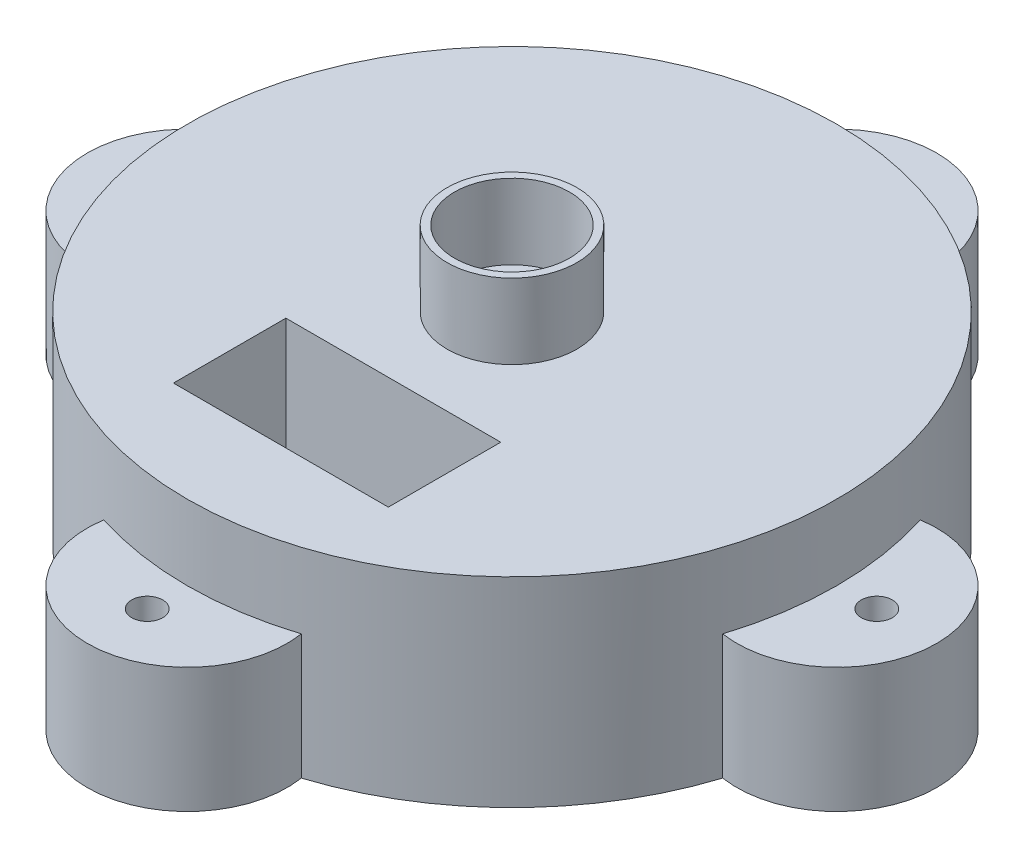
ISO-10303-21;
HEADER;
FILE_DESCRIPTION(('STEP AP214'),'2;1');
FILE_NAME('part.step','',(''),(''),'','','');
FILE_SCHEMA(('AUTOMOTIVE_DESIGN { 1 0 10303 214 1 1 1 1 }'));
ENDSEC;
DATA;
#1=APPLICATION_CONTEXT('core data for automotive mechanical design processes');
#2=APPLICATION_PROTOCOL_DEFINITION('international standard','automotive_design',2000,#1);
#3=PRODUCT_CONTEXT('',#1,'mechanical');
#4=PRODUCT('Part','Part','',(#3));
#5=PRODUCT_RELATED_PRODUCT_CATEGORY('part','',(#4));
#6=PRODUCT_DEFINITION_FORMATION('','',#4);
#7=PRODUCT_DEFINITION_CONTEXT('part definition',#1,'design');
#8=PRODUCT_DEFINITION('design','',#6,#7);
#9=PRODUCT_DEFINITION_SHAPE('','',#8);
#10=(LENGTH_UNIT() NAMED_UNIT(*) SI_UNIT(.MILLI.,.METRE.));
#11=(NAMED_UNIT(*) PLANE_ANGLE_UNIT() SI_UNIT($,.RADIAN.));
#12=(NAMED_UNIT(*) SI_UNIT($,.STERADIAN.) SOLID_ANGLE_UNIT());
#13=UNCERTAINTY_MEASURE_WITH_UNIT(LENGTH_MEASURE(1.E-05),#10,'distance_accuracy_value','');
#14=(GEOMETRIC_REPRESENTATION_CONTEXT(3) GLOBAL_UNCERTAINTY_ASSIGNED_CONTEXT((#13)) GLOBAL_UNIT_ASSIGNED_CONTEXT((#10,
#11,#12)) REPRESENTATION_CONTEXT('',''));
#15=CARTESIAN_POINT('',(0.,0.,0.));
#16=DIRECTION('',(0.,0.,1.));
#17=DIRECTION('',(1.,0.,0.));
#18=AXIS2_PLACEMENT_3D('',#15,#16,#17);
#19=CARTESIAN_POINT('',(0.,40.,0.));
#20=DIRECTION('',(0.,-1.,0.));
#21=DIRECTION('',(0.,0.,-1.));
#22=AXIS2_PLACEMENT_3D('',#19,#20,#21);
#23=CYLINDRICAL_SURFACE('',#22,65.);
#24=DIRECTION('',(0.,-1.,0.));
#25=VECTOR('',#24,1.);
#26=CARTESIAN_POINT('',(61.9230515913332,25.,19.7619756506552));
#27=LINE('',#26,#25);
#28=CARTESIAN_POINT('',(61.9230515913332,25.,19.7619756506552));
#29=VERTEX_POINT('',#28);
#30=CARTESIAN_POINT('',(61.9230515913332,0.,19.7619756506552));
#31=VERTEX_POINT('',#30);
#32=EDGE_CURVE('E206',#29,#31,#27,.T.);
#33=ORIENTED_EDGE('',*,*,#32,.F.);
#34=CARTESIAN_POINT('',(0.,25.,0.));
#35=DIRECTION('',(0.,-1.,0.));
#36=DIRECTION('',(0.,0.,-1.));
#37=AXIS2_PLACEMENT_3D('',#34,#35,#36);
#38=CIRCLE('',#37,65.);
#39=CARTESIAN_POINT('',(61.9231022547189,25.,-19.7618168990512));
#40=VERTEX_POINT('',#39);
#41=EDGE_CURVE('E199',#40,#29,#38,.T.);
#42=ORIENTED_EDGE('',*,*,#41,.F.);
#43=DIRECTION('',(0.,-1.,0.));
#44=VECTOR('',#43,1.);
#45=CARTESIAN_POINT('',(61.9231022547189,25.,-19.7618168990512));
#46=LINE('',#45,#44);
#47=CARTESIAN_POINT('',(61.9231022547189,0.,-19.7618168990512));
#48=VERTEX_POINT('',#47);
#49=EDGE_CURVE('E211',#40,#48,#46,.T.);
#50=ORIENTED_EDGE('',*,*,#49,.T.);
#51=CARTESIAN_POINT('',(0.,0.,0.));
#52=DIRECTION('',(0.,1.,0.));
#53=DIRECTION('',(0.,0.,1.));
#54=AXIS2_PLACEMENT_3D('',#51,#52,#53);
#55=CIRCLE('',#54,65.);
#56=CARTESIAN_POINT('',(19.761975650655,0.,-61.9230515913333));
#57=VERTEX_POINT('',#56);
#58=EDGE_CURVE('E313',#48,#57,#55,.T.);
#59=ORIENTED_EDGE('',*,*,#58,.T.);
#60=DIRECTION('',(0.,-1.,0.));
#61=VECTOR('',#60,1.);
#62=CARTESIAN_POINT('',(19.761975650655,25.,-61.9230515913333));
#63=LINE('',#62,#61);
#64=CARTESIAN_POINT('',(19.761975650655,25.,-61.9230515913333));
#65=VERTEX_POINT('',#64);
#66=EDGE_CURVE('E227',#65,#57,#63,.T.);
#67=ORIENTED_EDGE('',*,*,#66,.F.);
#68=CARTESIAN_POINT('',(0.,25.,0.));
#69=DIRECTION('',(0.,-1.,0.));
#70=DIRECTION('',(0.,0.,-1.));
#71=AXIS2_PLACEMENT_3D('',#68,#69,#70);
#72=CIRCLE('',#71,65.);
#73=CARTESIAN_POINT('',(-19.7618168990514,25.,-61.9231022547188));
#74=VERTEX_POINT('',#73);
#75=EDGE_CURVE('E220',#74,#65,#72,.T.);
#76=ORIENTED_EDGE('',*,*,#75,.F.);
#77=DIRECTION('',(0.,-1.,0.));
#78=VECTOR('',#77,1.);
#79=CARTESIAN_POINT('',(-19.7618168990514,25.,-61.9231022547188));
#80=LINE('',#79,#78);
#81=CARTESIAN_POINT('',(-19.7618168990514,0.,-61.9231022547188));
#82=VERTEX_POINT('',#81);
#83=EDGE_CURVE('E232',#74,#82,#80,.T.);
#84=ORIENTED_EDGE('',*,*,#83,.T.);
#85=CARTESIAN_POINT('',(-61.9230515913333,0.,-19.7619756506548));
#86=VERTEX_POINT('',#85);
#87=EDGE_CURVE('E315',#82,#86,#55,.T.);
#88=ORIENTED_EDGE('',*,*,#87,.T.);
#89=DIRECTION('',(0.,-1.,0.));
#90=VECTOR('',#89,1.);
#91=CARTESIAN_POINT('',(-61.9230515913333,25.,-19.7619756506548));
#92=LINE('',#91,#90);
#93=CARTESIAN_POINT('',(-61.9230515913333,25.,-19.7619756506548));
#94=VERTEX_POINT('',#93);
#95=EDGE_CURVE('E248',#94,#86,#92,.T.);
#96=ORIENTED_EDGE('',*,*,#95,.F.);
#97=CARTESIAN_POINT('',(0.,25.,0.));
#98=DIRECTION('',(0.,-1.,0.));
#99=DIRECTION('',(0.,0.,-1.));
#100=AXIS2_PLACEMENT_3D('',#97,#98,#99);
#101=CIRCLE('',#100,65.);
#102=CARTESIAN_POINT('',(-61.9231022547188,25.,19.7618168990516));
#103=VERTEX_POINT('',#102);
#104=EDGE_CURVE('E241',#103,#94,#101,.T.);
#105=ORIENTED_EDGE('',*,*,#104,.F.);
#106=DIRECTION('',(0.,-1.,0.));
#107=VECTOR('',#106,1.);
#108=CARTESIAN_POINT('',(-61.9231022547188,25.,19.7618168990516));
#109=LINE('',#108,#107);
#110=CARTESIAN_POINT('',(-61.9231022547188,0.,19.7618168990516));
#111=VERTEX_POINT('',#110);
#112=EDGE_CURVE('E253',#103,#111,#109,.T.);
#113=ORIENTED_EDGE('',*,*,#112,.T.);
#114=CARTESIAN_POINT('',(-19.7619756506545,0.,61.9230515913334));
#115=VERTEX_POINT('',#114);
#116=EDGE_CURVE('E310',#111,#115,#55,.T.);
#117=ORIENTED_EDGE('',*,*,#116,.T.);
#118=DIRECTION('',(0.,-1.,0.));
#119=VECTOR('',#118,1.);
#120=CARTESIAN_POINT('',(-19.7619756506545,25.,61.9230515913334));
#121=LINE('',#120,#119);
#122=CARTESIAN_POINT('',(-19.7619756506545,25.,61.9230515913334));
#123=VERTEX_POINT('',#122);
#124=EDGE_CURVE('E269',#123,#115,#121,.T.);
#125=ORIENTED_EDGE('',*,*,#124,.F.);
#126=CARTESIAN_POINT('',(0.,25.,0.));
#127=DIRECTION('',(0.,-1.,0.));
#128=DIRECTION('',(0.,0.,-1.));
#129=AXIS2_PLACEMENT_3D('',#126,#127,#128);
#130=CIRCLE('',#129,65.);
#131=CARTESIAN_POINT('',(19.7618168990518,25.,61.9231022547187));
#132=VERTEX_POINT('',#131);
#133=EDGE_CURVE('E266',#132,#123,#130,.T.);
#134=ORIENTED_EDGE('',*,*,#133,.F.);
#135=DIRECTION('',(0.,-1.,0.));
#136=VECTOR('',#135,1.);
#137=CARTESIAN_POINT('',(19.7618168990518,25.,61.9231022547187));
#138=LINE('',#137,#136);
#139=CARTESIAN_POINT('',(19.7618168990518,0.,61.9231022547187));
#140=VERTEX_POINT('',#139);
#141=EDGE_CURVE('E274',#132,#140,#138,.T.);
#142=ORIENTED_EDGE('',*,*,#141,.T.);
#143=EDGE_CURVE('E312',#140,#31,#55,.T.);
#144=ORIENTED_EDGE('',*,*,#143,.T.);
#145=EDGE_LOOP('',(#33,#42,#50,#59,#67,#76,#84,#88,#96,#105,#113,#117,#125,#134,#142,#144));
#146=FACE_BOUND('',#145,.T.);
#147=CARTESIAN_POINT('',(0.,40.,0.));
#148=DIRECTION('',(0.,1.,0.));
#149=DIRECTION('',(0.,0.,1.));
#150=AXIS2_PLACEMENT_3D('',#147,#148,#149);
#151=CIRCLE('',#150,65.);
#152=CARTESIAN_POINT('',(0.,40.,65.));
#153=VERTEX_POINT('',#152);
#154=EDGE_CURVE('E46',#153,#153,#151,.T.);
#155=ORIENTED_EDGE('',*,*,#154,.F.);
#156=EDGE_LOOP('',(#155));
#157=FACE_BOUND('',#156,.T.);
#158=DIRECTION('',(0.,-1.,0.));
#159=VECTOR('',#158,1.);
#160=CARTESIAN_POINT('',(-58.4024663648858,40.,28.5333475515648));
#161=LINE('',#160,#159);
#162=CARTESIAN_POINT('',(-58.4024663648858,12.326049230071,28.5333475515648));
#163=VERTEX_POINT('',#162);
#164=CARTESIAN_POINT('',(-58.4024663648858,7.32604923007102,28.5333475515648));
#165=VERTEX_POINT('',#164);
#166=EDGE_CURVE('E154',#163,#165,#161,.T.);
#167=ORIENTED_EDGE('',*,*,#166,.F.);
#168=CARTESIAN_POINT('',(0.,12.326049230071,0.));
#169=DIRECTION('',(0.,-1.,0.));
#170=DIRECTION('',(0.,0.,-1.));
#171=AXIS2_PLACEMENT_3D('',#168,#169,#170);
#172=CIRCLE('',#171,65.);
#173=CARTESIAN_POINT('',(-48.2684954287439,12.326049230071,43.5333475515648));
#174=VERTEX_POINT('',#173);
#175=EDGE_CURVE('E157',#174,#163,#172,.T.);
#176=ORIENTED_EDGE('',*,*,#175,.F.);
#177=DIRECTION('',(0.,-1.,0.));
#178=VECTOR('',#177,1.);
#179=CARTESIAN_POINT('',(-48.2684954287439,40.,43.5333475515648));
#180=LINE('',#179,#178);
#181=CARTESIAN_POINT('',(-48.2684954287439,7.32604923007102,43.5333475515648));
#182=VERTEX_POINT('',#181);
#183=EDGE_CURVE('E181',#182,#174,#180,.F.);
#184=ORIENTED_EDGE('',*,*,#183,.F.);
#185=CARTESIAN_POINT('',(0.,7.32604923007102,0.));
#186=DIRECTION('',(0.,1.,0.));
#187=DIRECTION('',(0.,0.,1.));
#188=AXIS2_PLACEMENT_3D('',#185,#186,#187);
#189=CIRCLE('',#188,65.);
#190=EDGE_CURVE('E183',#165,#182,#189,.T.);
#191=ORIENTED_EDGE('',*,*,#190,.F.);
#192=EDGE_LOOP('',(#167,#176,#184,#191));
#193=FACE_BOUND('',#192,.T.);
#194=ADVANCED_FACE('F39',(#146,#157,#193),#23,.T.);
#195=CARTESIAN_POINT('',(-21.5,2.,23.75));
#196=DIRECTION('',(1.,0.,0.));
#197=DIRECTION('',(0.,0.,-1.));
#198=AXIS2_PLACEMENT_3D('',#195,#196,#197);
#199=PLANE('',#198);
#200=DIRECTION('',(0.,0.,-1.));
#201=VECTOR('',#200,1.);
#202=CARTESIAN_POINT('',(-21.5,40.,23.75));
#203=LINE('',#202,#201);
#204=CARTESIAN_POINT('',(-21.5,40.,46.25));
#205=VERTEX_POINT('',#204);
#206=CARTESIAN_POINT('',(-21.5,40.,23.75));
#207=VERTEX_POINT('',#206);
#208=EDGE_CURVE('E277',#205,#207,#203,.T.);
#209=ORIENTED_EDGE('',*,*,#208,.F.);
#210=DIRECTION('',(0.,1.,0.));
#211=VECTOR('',#210,1.);
#212=CARTESIAN_POINT('',(-21.5,2.,46.25));
#213=LINE('',#212,#211);
#214=CARTESIAN_POINT('',(-21.5,2.,46.25));
#215=VERTEX_POINT('',#214);
#216=EDGE_CURVE('E290',#215,#205,#213,.T.);
#217=ORIENTED_EDGE('',*,*,#216,.F.);
#218=DIRECTION('',(0.,0.,-1.));
#219=VECTOR('',#218,1.);
#220=CARTESIAN_POINT('',(-21.5,2.,23.75));
#221=LINE('',#220,#219);
#222=CARTESIAN_POINT('',(-21.5,2.,23.75));
#223=VERTEX_POINT('',#222);
#224=EDGE_CURVE('E280',#215,#223,#221,.T.);
#225=ORIENTED_EDGE('',*,*,#224,.T.);
#226=DIRECTION('',(0.,1.,0.));
#227=VECTOR('',#226,1.);
#228=CARTESIAN_POINT('',(-21.5,2.,23.75));
#229=LINE('',#228,#227);
#230=EDGE_CURVE('E307',#223,#207,#229,.T.);
#231=ORIENTED_EDGE('',*,*,#230,.T.);
#232=EDGE_LOOP('',(#209,#217,#225,#231));
#233=FACE_BOUND('',#232,.T.);
#234=DIRECTION('',(0.,0.,-1.));
#235=VECTOR('',#234,1.);
#236=CARTESIAN_POINT('',(-21.5,12.326049230071,43.5333475515648));
#237=LINE('',#236,#235);
#238=CARTESIAN_POINT('',(-21.5,12.326049230071,43.5333475515648));
#239=VERTEX_POINT('',#238);
#240=CARTESIAN_POINT('',(-21.5,12.326049230071,28.5333475515648));
#241=VERTEX_POINT('',#240);
#242=EDGE_CURVE('E171',#239,#241,#237,.T.);
#243=ORIENTED_EDGE('',*,*,#242,.T.);
#244=DIRECTION('',(0.,-1.,0.));
#245=VECTOR('',#244,1.);
#246=CARTESIAN_POINT('',(-21.5,7.32604923007102,28.5333475515648));
#247=LINE('',#246,#245);
#248=CARTESIAN_POINT('',(-21.5,7.32604923007102,28.5333475515648));
#249=VERTEX_POINT('',#248);
#250=EDGE_CURVE('E61',#241,#249,#247,.T.);
#251=ORIENTED_EDGE('',*,*,#250,.T.);
#252=DIRECTION('',(0.,0.,1.));
#253=VECTOR('',#252,1.);
#254=CARTESIAN_POINT('',(-21.5,7.32604923007102,43.5333475515648));
#255=LINE('',#254,#253);
#256=CARTESIAN_POINT('',(-21.5,7.32604923007102,43.5333475515648));
#257=VERTEX_POINT('',#256);
#258=EDGE_CURVE('E161',#249,#257,#255,.T.);
#259=ORIENTED_EDGE('',*,*,#258,.T.);
#260=DIRECTION('',(0.,1.,0.));
#261=VECTOR('',#260,1.);
#262=CARTESIAN_POINT('',(-21.5,7.32604923007102,43.5333475515648));
#263=LINE('',#262,#261);
#264=EDGE_CURVE('E167',#257,#239,#263,.T.);
#265=ORIENTED_EDGE('',*,*,#264,.T.);
#266=EDGE_LOOP('',(#243,#251,#259,#265));
#267=FACE_BOUND('',#266,.T.);
#268=ADVANCED_FACE('F170',(#233,#267),#199,.T.);
#269=CARTESIAN_POINT('',(0.,40.,0.));
#270=DIRECTION('',(0.,1.,0.));
#271=DIRECTION('',(0.,0.,1.));
#272=AXIS2_PLACEMENT_3D('',#269,#270,#271);
#273=PLANE('',#272);
#274=CARTESIAN_POINT('',(0.,40.,0.));
#275=DIRECTION('',(0.,1.,0.));
#276=DIRECTION('',(0.,0.,1.));
#277=AXIS2_PLACEMENT_3D('',#274,#275,#276);
#278=CIRCLE('',#277,13.);
#279=CARTESIAN_POINT('',(0.,40.,13.));
#280=VERTEX_POINT('',#279);
#281=EDGE_CURVE('E11',#280,#280,#278,.T.);
#282=ORIENTED_EDGE('',*,*,#281,.F.);
#283=EDGE_LOOP('',(#282));
#284=FACE_BOUND('',#283,.T.);
#285=ORIENTED_EDGE('',*,*,#154,.T.);
#286=EDGE_LOOP('',(#285));
#287=FACE_BOUND('',#286,.T.);
#288=DIRECTION('',(-1.,0.,0.));
#289=VECTOR('',#288,1.);
#290=CARTESIAN_POINT('',(21.5,40.,46.25));
#291=LINE('',#290,#289);
#292=CARTESIAN_POINT('',(21.5,40.,46.25));
#293=VERTEX_POINT('',#292);
#294=EDGE_CURVE('E284',#293,#205,#291,.T.);
#295=ORIENTED_EDGE('',*,*,#294,.T.);
#296=ORIENTED_EDGE('',*,*,#208,.T.);
#297=DIRECTION('',(1.,0.,0.));
#298=VECTOR('',#297,1.);
#299=CARTESIAN_POINT('',(21.5,40.,23.75));
#300=LINE('',#299,#298);
#301=CARTESIAN_POINT('',(21.5,40.,23.75));
#302=VERTEX_POINT('',#301);
#303=EDGE_CURVE('E293',#207,#302,#300,.T.);
#304=ORIENTED_EDGE('',*,*,#303,.T.);
#305=DIRECTION('',(0.,0.,1.));
#306=VECTOR('',#305,1.);
#307=CARTESIAN_POINT('',(21.5,40.,23.75));
#308=LINE('',#307,#306);
#309=EDGE_CURVE('E296',#302,#293,#308,.T.);
#310=ORIENTED_EDGE('',*,*,#309,.T.);
#311=EDGE_LOOP('',(#295,#296,#304,#310));
#312=FACE_BOUND('',#311,.T.);
#313=ADVANCED_FACE('F345',(#284,#287,#312),#273,.T.);
#314=CARTESIAN_POINT('',(0.,0.,0.));
#315=DIRECTION('',(0.,1.,0.));
#316=DIRECTION('',(0.,0.,1.));
#317=AXIS2_PLACEMENT_3D('',#314,#315,#316);
#318=PLANE('',#317);
#319=ORIENTED_EDGE('',*,*,#143,.F.);
#320=CARTESIAN_POINT('',(-8.33199405442242E-05,0.,64.9999999999466));
#321=DIRECTION('',(0.,-1.,0.));
#322=DIRECTION('',(0.,0.,-1.));
#323=AXIS2_PLACEMENT_3D('',#320,#321,#322);
#324=CIRCLE('',#323,20.);
#325=EDGE_CURVE('E263',#115,#140,#324,.F.);
#326=ORIENTED_EDGE('',*,*,#325,.F.);
#327=ORIENTED_EDGE('',*,*,#116,.F.);
#328=CARTESIAN_POINT('',(-64.9999999999466,0.,-8.33199407711705E-05));
#329=DIRECTION('',(0.,-1.,0.));
#330=DIRECTION('',(0.,0.,-1.));
#331=AXIS2_PLACEMENT_3D('',#328,#329,#330);
#332=CIRCLE('',#331,20.);
#333=EDGE_CURVE('E235',#86,#111,#332,.F.);
#334=ORIENTED_EDGE('',*,*,#333,.F.);
#335=ORIENTED_EDGE('',*,*,#87,.F.);
#336=CARTESIAN_POINT('',(8.33199409981168E-05,0.,-64.9999999999466));
#337=DIRECTION('',(0.,-1.,0.));
#338=DIRECTION('',(0.,0.,-1.));
#339=AXIS2_PLACEMENT_3D('',#336,#337,#338);
#340=CIRCLE('',#339,20.);
#341=EDGE_CURVE('E214',#57,#82,#340,.F.);
#342=ORIENTED_EDGE('',*,*,#341,.F.);
#343=ORIENTED_EDGE('',*,*,#58,.F.);
#344=CARTESIAN_POINT('',(64.9999999999466,0.,8.33199412250631E-05));
#345=DIRECTION('',(0.,-1.,0.));
#346=DIRECTION('',(0.,0.,-1.));
#347=AXIS2_PLACEMENT_3D('',#344,#345,#346);
#348=CIRCLE('',#347,20.);
#349=EDGE_CURVE('E195',#31,#48,#348,.F.);
#350=ORIENTED_EDGE('',*,*,#349,.F.);
#351=EDGE_LOOP('',(#319,#326,#327,#334,#335,#342,#343,#350));
#352=FACE_BOUND('',#351,.T.);
#353=CARTESIAN_POINT('',(-8.33199405432445E-05,0.,72.9999999999466));
#354=DIRECTION('',(0.,-1.,0.));
#355=DIRECTION('',(0.,0.,-1.));
#356=AXIS2_PLACEMENT_3D('',#353,#354,#355);
#357=CIRCLE('',#356,3.1);
#358=CARTESIAN_POINT('',(-8.33199405432445E-05,0.,69.8999999999466));
#359=VERTEX_POINT('',#358);
#360=EDGE_CURVE('E256',#359,#359,#357,.F.);
#361=ORIENTED_EDGE('',*,*,#360,.T.);
#362=EDGE_LOOP('',(#361));
#363=FACE_BOUND('',#362,.T.);
#364=CARTESIAN_POINT('',(-72.9999999999466,0.,-8.33199407981226E-05));
#365=DIRECTION('',(0.,-1.,0.));
#366=DIRECTION('',(0.,0.,-1.));
#367=AXIS2_PLACEMENT_3D('',#364,#365,#366);
#368=CIRCLE('',#367,3.1);
#369=CARTESIAN_POINT('',(-72.9999999999466,0.,-3.1000833199408));
#370=VERTEX_POINT('',#369);
#371=EDGE_CURVE('E242',#370,#370,#368,.F.);
#372=ORIENTED_EDGE('',*,*,#371,.T.);
#373=EDGE_LOOP('',(#372));
#374=FACE_BOUND('',#373,.T.);
#375=CARTESIAN_POINT('',(8.33199410530008E-05,0.,-72.9999999999466));
#376=DIRECTION('',(0.,-1.,0.));
#377=DIRECTION('',(0.,0.,-1.));
#378=AXIS2_PLACEMENT_3D('',#375,#376,#377);
#379=CIRCLE('',#378,3.1);
#380=CARTESIAN_POINT('',(8.33199410530008E-05,0.,-76.0999999999466));
#381=VERTEX_POINT('',#380);
#382=EDGE_CURVE('E221',#381,#381,#379,.F.);
#383=ORIENTED_EDGE('',*,*,#382,.T.);
#384=EDGE_LOOP('',(#383));
#385=FACE_BOUND('',#384,.T.);
#386=CARTESIAN_POINT('',(72.9999999999466,0.,8.33199413078789E-05));
#387=DIRECTION('',(0.,-1.,0.));
#388=DIRECTION('',(0.,0.,-1.));
#389=AXIS2_PLACEMENT_3D('',#386,#387,#388);
#390=CIRCLE('',#389,3.1);
#391=CARTESIAN_POINT('',(72.9999999999466,0.,-3.09991668005869));
#392=VERTEX_POINT('',#391);
#393=EDGE_CURVE('E200',#392,#392,#390,.F.);
#394=ORIENTED_EDGE('',*,*,#393,.T.);
#395=EDGE_LOOP('',(#394));
#396=FACE_BOUND('',#395,.T.);
#397=ADVANCED_FACE('F325',(#352,#363,#374,#385,#396),#318,.F.);
#398=CARTESIAN_POINT('',(21.5,2.,23.75));
#399=DIRECTION('',(0.,0.,1.));
#400=DIRECTION('',(1.,0.,0.));
#401=AXIS2_PLACEMENT_3D('',#398,#399,#400);
#402=PLANE('',#401);
#403=ORIENTED_EDGE('',*,*,#303,.F.);
#404=ORIENTED_EDGE('',*,*,#230,.F.);
#405=DIRECTION('',(1.,0.,0.));
#406=VECTOR('',#405,1.);
#407=CARTESIAN_POINT('',(21.5,2.,23.75));
#408=LINE('',#407,#406);
#409=CARTESIAN_POINT('',(21.5,2.,23.75));
#410=VERTEX_POINT('',#409);
#411=EDGE_CURVE('E283',#223,#410,#408,.T.);
#412=ORIENTED_EDGE('',*,*,#411,.T.);
#413=DIRECTION('',(0.,1.,0.));
#414=VECTOR('',#413,1.);
#415=CARTESIAN_POINT('',(21.5,2.,23.75));
#416=LINE('',#415,#414);
#417=EDGE_CURVE('E305',#410,#302,#416,.T.);
#418=ORIENTED_EDGE('',*,*,#417,.T.);
#419=EDGE_LOOP('',(#403,#404,#412,#418));
#420=FACE_BOUND('',#419,.T.);
#421=ADVANCED_FACE('F344',(#420),#402,.T.);
#422=CARTESIAN_POINT('',(21.5,2.,23.75));
#423=DIRECTION('',(-1.,0.,0.));
#424=DIRECTION('',(0.,0.,1.));
#425=AXIS2_PLACEMENT_3D('',#422,#423,#424);
#426=PLANE('',#425);
#427=ORIENTED_EDGE('',*,*,#309,.F.);
#428=ORIENTED_EDGE('',*,*,#417,.F.);
#429=DIRECTION('',(0.,0.,1.));
#430=VECTOR('',#429,1.);
#431=CARTESIAN_POINT('',(21.5,2.,23.75));
#432=LINE('',#431,#430);
#433=CARTESIAN_POINT('',(21.5,2.,46.25));
#434=VERTEX_POINT('',#433);
#435=EDGE_CURVE('E286',#410,#434,#432,.T.);
#436=ORIENTED_EDGE('',*,*,#435,.T.);
#437=DIRECTION('',(0.,1.,0.));
#438=VECTOR('',#437,1.);
#439=CARTESIAN_POINT('',(21.5,2.,46.25));
#440=LINE('',#439,#438);
#441=EDGE_CURVE('E303',#434,#293,#440,.T.);
#442=ORIENTED_EDGE('',*,*,#441,.T.);
#443=EDGE_LOOP('',(#427,#428,#436,#442));
#444=FACE_BOUND('',#443,.T.);
#445=ADVANCED_FACE('F383',(#444),#426,.T.);
#446=CARTESIAN_POINT('',(21.5,2.,46.25));
#447=DIRECTION('',(0.,0.,-1.));
#448=DIRECTION('',(0.,1.,0.));
#449=AXIS2_PLACEMENT_3D('',#446,#447,#448);
#450=PLANE('',#449);
#451=ORIENTED_EDGE('',*,*,#294,.F.);
#452=ORIENTED_EDGE('',*,*,#441,.F.);
#453=DIRECTION('',(-1.,0.,0.));
#454=VECTOR('',#453,1.);
#455=CARTESIAN_POINT('',(21.5,2.,46.25));
#456=LINE('',#455,#454);
#457=EDGE_CURVE('E288',#434,#215,#456,.T.);
#458=ORIENTED_EDGE('',*,*,#457,.T.);
#459=ORIENTED_EDGE('',*,*,#216,.T.);
#460=EDGE_LOOP('',(#451,#452,#458,#459));
#461=FACE_BOUND('',#460,.T.);
#462=ADVANCED_FACE('F387',(#461),#450,.T.);
#463=CARTESIAN_POINT('',(0.,2.,0.));
#464=DIRECTION('',(0.,-1.,0.));
#465=DIRECTION('',(0.,0.,-1.));
#466=AXIS2_PLACEMENT_3D('',#463,#464,#465);
#467=PLANE('',#466);
#468=ORIENTED_EDGE('',*,*,#224,.F.);
#469=ORIENTED_EDGE('',*,*,#457,.F.);
#470=ORIENTED_EDGE('',*,*,#435,.F.);
#471=ORIENTED_EDGE('',*,*,#411,.F.);
#472=EDGE_LOOP('',(#468,#469,#470,#471));
#473=FACE_BOUND('',#472,.T.);
#474=ADVANCED_FACE('F391',(#473),#467,.F.);
#475=CARTESIAN_POINT('',(-8.33199405442242E-05,25.,64.9999999999466));
#476=DIRECTION('',(0.,-1.,0.));
#477=DIRECTION('',(0.,0.,-1.));
#478=AXIS2_PLACEMENT_3D('',#475,#476,#477);
#479=CYLINDRICAL_SURFACE('',#478,20.);
#480=ORIENTED_EDGE('',*,*,#325,.T.);
#481=ORIENTED_EDGE('',*,*,#141,.F.);
#482=CARTESIAN_POINT('',(-8.33199405442242E-05,25.,64.9999999999466));
#483=DIRECTION('',(0.,-1.,0.));
#484=DIRECTION('',(0.,0.,-1.));
#485=AXIS2_PLACEMENT_3D('',#482,#483,#484);
#486=CIRCLE('',#485,20.);
#487=EDGE_CURVE('E262',#123,#132,#486,.F.);
#488=ORIENTED_EDGE('',*,*,#487,.F.);
#489=ORIENTED_EDGE('',*,*,#124,.T.);
#490=EDGE_LOOP('',(#480,#481,#488,#489));
#491=FACE_BOUND('',#490,.T.);
#492=ADVANCED_FACE('F395',(#491),#479,.T.);
#493=CARTESIAN_POINT('',(-8.33199405432445E-05,25.,72.9999999999466));
#494=DIRECTION('',(0.,-1.,0.));
#495=DIRECTION('',(0.,0.,-1.));
#496=AXIS2_PLACEMENT_3D('',#493,#494,#495);
#497=CYLINDRICAL_SURFACE('',#496,3.1);
#498=CARTESIAN_POINT('',(-8.33199405432445E-05,25.,72.9999999999466));
#499=DIRECTION('',(0.,-1.,0.));
#500=DIRECTION('',(0.,0.,-1.));
#501=AXIS2_PLACEMENT_3D('',#498,#499,#500);
#502=CIRCLE('',#501,3.1);
#503=CARTESIAN_POINT('',(-8.33199405432445E-05,25.,69.8999999999466));
#504=VERTEX_POINT('',#503);
#505=EDGE_CURVE('E259',#504,#504,#502,.F.);
#506=ORIENTED_EDGE('',*,*,#505,.T.);
#507=EDGE_LOOP('',(#506));
#508=FACE_BOUND('',#507,.T.);
#509=ORIENTED_EDGE('',*,*,#360,.F.);
#510=EDGE_LOOP('',(#509));
#511=FACE_BOUND('',#510,.T.);
#512=ADVANCED_FACE('F397',(#508,#511),#497,.F.);
#513=CARTESIAN_POINT('',(0.,25.,0.));
#514=DIRECTION('',(0.,-1.,0.));
#515=DIRECTION('',(0.,0.,-1.));
#516=AXIS2_PLACEMENT_3D('',#513,#514,#515);
#517=PLANE('',#516);
#518=ORIENTED_EDGE('',*,*,#505,.F.);
#519=EDGE_LOOP('',(#518));
#520=FACE_BOUND('',#519,.T.);
#521=ORIENTED_EDGE('',*,*,#487,.T.);
#522=ORIENTED_EDGE('',*,*,#133,.T.);
#523=EDGE_LOOP('',(#521,#522));
#524=FACE_BOUND('',#523,.T.);
#525=ADVANCED_FACE('F400',(#520,#524),#517,.F.);
#526=CARTESIAN_POINT('',(-64.9999999999466,25.,-8.33199407696397E-05));
#527=DIRECTION('',(0.,-1.,0.));
#528=DIRECTION('',(0.,0.,-1.));
#529=AXIS2_PLACEMENT_3D('',#526,#527,#528);
#530=CYLINDRICAL_SURFACE('',#529,20.);
#531=ORIENTED_EDGE('',*,*,#333,.T.);
#532=ORIENTED_EDGE('',*,*,#112,.F.);
#533=CARTESIAN_POINT('',(-64.9999999999466,25.,-8.33199407696397E-05));
#534=DIRECTION('',(0.,-1.,0.));
#535=DIRECTION('',(0.,0.,-1.));
#536=AXIS2_PLACEMENT_3D('',#533,#534,#535);
#537=CIRCLE('',#536,20.);
#538=EDGE_CURVE('E238',#94,#103,#537,.F.);
#539=ORIENTED_EDGE('',*,*,#538,.F.);
#540=ORIENTED_EDGE('',*,*,#95,.T.);
#541=EDGE_LOOP('',(#531,#532,#539,#540));
#542=FACE_BOUND('',#541,.T.);
#543=ADVANCED_FACE('F323',(#542),#530,.T.);
#544=CARTESIAN_POINT('',(-72.9999999999466,25.,-8.33199407965918E-05));
#545=DIRECTION('',(0.,-1.,0.));
#546=DIRECTION('',(0.,0.,-1.));
#547=AXIS2_PLACEMENT_3D('',#544,#545,#546);
#548=CYLINDRICAL_SURFACE('',#547,3.1);
#549=CARTESIAN_POINT('',(-72.9999999999466,25.,-8.33199407965918E-05));
#550=DIRECTION('',(0.,-1.,0.));
#551=DIRECTION('',(0.,0.,-1.));
#552=AXIS2_PLACEMENT_3D('',#549,#550,#551);
#553=CIRCLE('',#552,3.1);
#554=CARTESIAN_POINT('',(-72.9999999999466,25.,-3.1000833199408));
#555=VERTEX_POINT('',#554);
#556=EDGE_CURVE('E245',#555,#555,#553,.F.);
#557=ORIENTED_EDGE('',*,*,#556,.T.);
#558=EDGE_LOOP('',(#557));
#559=FACE_BOUND('',#558,.T.);
#560=ORIENTED_EDGE('',*,*,#371,.F.);
#561=EDGE_LOOP('',(#560));
#562=FACE_BOUND('',#561,.T.);
#563=ADVANCED_FACE('F333',(#559,#562),#548,.F.);
#564=CARTESIAN_POINT('',(0.,25.,0.));
#565=DIRECTION('',(0.,-1.,0.));
#566=DIRECTION('',(0.,0.,-1.));
#567=AXIS2_PLACEMENT_3D('',#564,#565,#566);
#568=PLANE('',#567);
#569=ORIENTED_EDGE('',*,*,#538,.T.);
#570=ORIENTED_EDGE('',*,*,#104,.T.);
#571=EDGE_LOOP('',(#569,#570));
#572=FACE_BOUND('',#571,.T.);
#573=ORIENTED_EDGE('',*,*,#556,.F.);
#574=EDGE_LOOP('',(#573));
#575=FACE_BOUND('',#574,.T.);
#576=ADVANCED_FACE('F329',(#572,#575),#568,.F.);
#577=CARTESIAN_POINT('',(8.33199409981168E-05,25.,-64.9999999999466));
#578=DIRECTION('',(0.,-1.,0.));
#579=DIRECTION('',(0.,0.,-1.));
#580=AXIS2_PLACEMENT_3D('',#577,#578,#579);
#581=CYLINDRICAL_SURFACE('',#580,20.);
#582=ORIENTED_EDGE('',*,*,#341,.T.);
#583=ORIENTED_EDGE('',*,*,#83,.F.);
#584=CARTESIAN_POINT('',(8.33199409981168E-05,25.,-64.9999999999466));
#585=DIRECTION('',(0.,-1.,0.));
#586=DIRECTION('',(0.,0.,-1.));
#587=AXIS2_PLACEMENT_3D('',#584,#585,#586);
#588=CIRCLE('',#587,20.);
#589=EDGE_CURVE('E217',#65,#74,#588,.F.);
#590=ORIENTED_EDGE('',*,*,#589,.F.);
#591=ORIENTED_EDGE('',*,*,#66,.T.);
#592=EDGE_LOOP('',(#582,#583,#590,#591));
#593=FACE_BOUND('',#592,.T.);
#594=ADVANCED_FACE('F332',(#593),#581,.T.);
#595=CARTESIAN_POINT('',(8.33199410530008E-05,25.,-72.9999999999466));
#596=DIRECTION('',(0.,-1.,0.));
#597=DIRECTION('',(0.,0.,-1.));
#598=AXIS2_PLACEMENT_3D('',#595,#596,#597);
#599=CYLINDRICAL_SURFACE('',#598,3.1);
#600=CARTESIAN_POINT('',(8.33199410530008E-05,25.,-72.9999999999466));
#601=DIRECTION('',(0.,-1.,0.));
#602=DIRECTION('',(0.,0.,-1.));
#603=AXIS2_PLACEMENT_3D('',#600,#601,#602);
#604=CIRCLE('',#603,3.1);
#605=CARTESIAN_POINT('',(8.33199410530008E-05,25.,-76.0999999999466));
#606=VERTEX_POINT('',#605);
#607=EDGE_CURVE('E224',#606,#606,#604,.F.);
#608=ORIENTED_EDGE('',*,*,#607,.T.);
#609=EDGE_LOOP('',(#608));
#610=FACE_BOUND('',#609,.T.);
#611=ORIENTED_EDGE('',*,*,#382,.F.);
#612=EDGE_LOOP('',(#611));
#613=FACE_BOUND('',#612,.T.);
#614=ADVANCED_FACE('F412',(#610,#613),#599,.F.);
#615=CARTESIAN_POINT('',(0.,25.,0.));
#616=DIRECTION('',(0.,-1.,0.));
#617=DIRECTION('',(0.,0.,-1.));
#618=AXIS2_PLACEMENT_3D('',#615,#616,#617);
#619=PLANE('',#618);
#620=ORIENTED_EDGE('',*,*,#589,.T.);
#621=ORIENTED_EDGE('',*,*,#75,.T.);
#622=EDGE_LOOP('',(#620,#621));
#623=FACE_BOUND('',#622,.T.);
#624=ORIENTED_EDGE('',*,*,#607,.F.);
#625=EDGE_LOOP('',(#624));
#626=FACE_BOUND('',#625,.T.);
#627=ADVANCED_FACE('F363',(#623,#626),#619,.F.);
#628=CARTESIAN_POINT('',(64.9999999999466,25.,8.33199412265939E-05));
#629=DIRECTION('',(0.,-1.,0.));
#630=DIRECTION('',(0.,0.,-1.));
#631=AXIS2_PLACEMENT_3D('',#628,#629,#630);
#632=CYLINDRICAL_SURFACE('',#631,20.);
#633=ORIENTED_EDGE('',*,*,#349,.T.);
#634=ORIENTED_EDGE('',*,*,#49,.F.);
#635=CARTESIAN_POINT('',(64.9999999999466,25.,8.33199412265939E-05));
#636=DIRECTION('',(0.,-1.,0.));
#637=DIRECTION('',(0.,0.,-1.));
#638=AXIS2_PLACEMENT_3D('',#635,#636,#637);
#639=CIRCLE('',#638,20.);
#640=EDGE_CURVE('E196',#29,#40,#639,.F.);
#641=ORIENTED_EDGE('',*,*,#640,.F.);
#642=ORIENTED_EDGE('',*,*,#32,.T.);
#643=EDGE_LOOP('',(#633,#634,#641,#642));
#644=FACE_BOUND('',#643,.T.);
#645=ADVANCED_FACE('F353',(#644),#632,.T.);
#646=CARTESIAN_POINT('',(72.9999999999466,25.,8.33199413094097E-05));
#647=DIRECTION('',(0.,-1.,0.));
#648=DIRECTION('',(0.,0.,-1.));
#649=AXIS2_PLACEMENT_3D('',#646,#647,#648);
#650=CYLINDRICAL_SURFACE('',#649,3.1);
#651=CARTESIAN_POINT('',(72.9999999999466,25.,8.33199413094097E-05));
#652=DIRECTION('',(0.,-1.,0.));
#653=DIRECTION('',(0.,0.,-1.));
#654=AXIS2_PLACEMENT_3D('',#651,#652,#653);
#655=CIRCLE('',#654,3.1);
#656=CARTESIAN_POINT('',(72.9999999999466,25.,-3.09991668005869));
#657=VERTEX_POINT('',#656);
#658=EDGE_CURVE('E203',#657,#657,#655,.F.);
#659=ORIENTED_EDGE('',*,*,#658,.T.);
#660=EDGE_LOOP('',(#659));
#661=FACE_BOUND('',#660,.T.);
#662=ORIENTED_EDGE('',*,*,#393,.F.);
#663=EDGE_LOOP('',(#662));
#664=FACE_BOUND('',#663,.T.);
#665=ADVANCED_FACE('F350',(#661,#664),#650,.F.);
#666=CARTESIAN_POINT('',(0.,25.,0.));
#667=DIRECTION('',(0.,-1.,0.));
#668=DIRECTION('',(0.,0.,-1.));
#669=AXIS2_PLACEMENT_3D('',#666,#667,#668);
#670=PLANE('',#669);
#671=ORIENTED_EDGE('',*,*,#640,.T.);
#672=ORIENTED_EDGE('',*,*,#41,.T.);
#673=EDGE_LOOP('',(#671,#672));
#674=FACE_BOUND('',#673,.T.);
#675=ORIENTED_EDGE('',*,*,#658,.F.);
#676=EDGE_LOOP('',(#675));
#677=FACE_BOUND('',#676,.T.);
#678=ADVANCED_FACE('F352',(#674,#677),#670,.F.);
#679=CARTESIAN_POINT('',(0.,55.,0.));
#680=DIRECTION('',(0.,-1.,0.));
#681=DIRECTION('',(0.,0.,-1.));
#682=AXIS2_PLACEMENT_3D('',#679,#680,#681);
#683=CYLINDRICAL_SURFACE('',#682,13.);
#684=CARTESIAN_POINT('',(0.,55.,0.));
#685=DIRECTION('',(0.,-1.,0.));
#686=DIRECTION('',(0.,0.,-1.));
#687=AXIS2_PLACEMENT_3D('',#684,#685,#686);
#688=CIRCLE('',#687,13.);
#689=CARTESIAN_POINT('',(0.,55.,-13.));
#690=VERTEX_POINT('',#689);
#691=EDGE_CURVE('E190',#690,#690,#688,.T.);
#692=ORIENTED_EDGE('',*,*,#691,.T.);
#693=EDGE_LOOP('',(#692));
#694=FACE_BOUND('',#693,.T.);
#695=ORIENTED_EDGE('',*,*,#281,.T.);
#696=EDGE_LOOP('',(#695));
#697=FACE_BOUND('',#696,.T.);
#698=ADVANCED_FACE('F360',(#694,#697),#683,.T.);
#699=CARTESIAN_POINT('',(0.,55.,0.));
#700=DIRECTION('',(0.,-1.,0.));
#701=DIRECTION('',(0.,0.,-1.));
#702=AXIS2_PLACEMENT_3D('',#699,#700,#701);
#703=PLANE('',#702);
#704=CARTESIAN_POINT('',(0.,55.,0.));
#705=DIRECTION('',(0.,-1.,0.));
#706=DIRECTION('',(0.,0.,-1.));
#707=AXIS2_PLACEMENT_3D('',#704,#705,#706);
#708=CIRCLE('',#707,11.5);
#709=CARTESIAN_POINT('',(0.,55.,-11.5));
#710=VERTEX_POINT('',#709);
#711=EDGE_CURVE('E187',#710,#710,#708,.T.);
#712=ORIENTED_EDGE('',*,*,#711,.T.);
#713=EDGE_LOOP('',(#712));
#714=FACE_BOUND('',#713,.T.);
#715=ORIENTED_EDGE('',*,*,#691,.F.);
#716=EDGE_LOOP('',(#715));
#717=FACE_BOUND('',#716,.T.);
#718=ADVANCED_FACE('F459',(#714,#717),#703,.F.);
#719=CARTESIAN_POINT('',(0.,55.,0.));
#720=DIRECTION('',(0.,-1.,0.));
#721=DIRECTION('',(0.,0.,-1.));
#722=AXIS2_PLACEMENT_3D('',#719,#720,#721);
#723=CYLINDRICAL_SURFACE('',#722,11.5);
#724=ORIENTED_EDGE('',*,*,#711,.F.);
#725=EDGE_LOOP('',(#724));
#726=FACE_BOUND('',#725,.T.);
#727=CARTESIAN_POINT('',(0.,40.,0.));
#728=DIRECTION('',(0.,-1.,0.));
#729=DIRECTION('',(0.,0.,-1.));
#730=AXIS2_PLACEMENT_3D('',#727,#728,#729);
#731=CIRCLE('',#730,11.5);
#732=CARTESIAN_POINT('',(0.,40.,-11.5));
#733=VERTEX_POINT('',#732);
#734=EDGE_CURVE('E186',#733,#733,#731,.T.);
#735=ORIENTED_EDGE('',*,*,#734,.T.);
#736=EDGE_LOOP('',(#735));
#737=FACE_BOUND('',#736,.T.);
#738=ADVANCED_FACE('F451',(#726,#737),#723,.F.);
#739=ORIENTED_EDGE('',*,*,#734,.F.);
#740=EDGE_LOOP('',(#739));
#741=FACE_BOUND('',#740,.T.);
#742=ADVANCED_FACE('F379',(#741),#273,.T.);
#743=CARTESIAN_POINT('',(-81.5,7.32604923007102,28.5333475515648));
#744=DIRECTION('',(0.,0.,1.));
#745=DIRECTION('',(1.,0.,0.));
#746=AXIS2_PLACEMENT_3D('',#743,#744,#745);
#747=PLANE('',#746);
#748=ORIENTED_EDGE('',*,*,#166,.T.);
#749=DIRECTION('',(1.,0.,0.));
#750=VECTOR('',#749,1.);
#751=CARTESIAN_POINT('',(-81.5,7.32604923007102,28.5333475515648));
#752=LINE('',#751,#750);
#753=EDGE_CURVE('E150',#165,#249,#752,.T.);
#754=ORIENTED_EDGE('',*,*,#753,.T.);
#755=ORIENTED_EDGE('',*,*,#250,.F.);
#756=DIRECTION('',(1.,0.,0.));
#757=VECTOR('',#756,1.);
#758=CARTESIAN_POINT('',(-81.5,12.326049230071,28.5333475515648));
#759=LINE('',#758,#757);
#760=EDGE_CURVE('E176',#163,#241,#759,.T.);
#761=ORIENTED_EDGE('',*,*,#760,.F.);
#762=EDGE_LOOP('',(#748,#754,#755,#761));
#763=FACE_BOUND('',#762,.T.);
#764=ADVANCED_FACE('F152',(#763),#747,.T.);
#765=CARTESIAN_POINT('',(-81.5,7.32604923007102,43.5333475515648));
#766=DIRECTION('',(0.,1.,0.));
#767=DIRECTION('',(0.,0.,1.));
#768=AXIS2_PLACEMENT_3D('',#765,#766,#767);
#769=PLANE('',#768);
#770=ORIENTED_EDGE('',*,*,#190,.T.);
#771=DIRECTION('',(1.,0.,0.));
#772=VECTOR('',#771,1.);
#773=CARTESIAN_POINT('',(-81.5,7.32604923007102,43.5333475515648));
#774=LINE('',#773,#772);
#775=EDGE_CURVE('E158',#182,#257,#774,.T.);
#776=ORIENTED_EDGE('',*,*,#775,.T.);
#777=ORIENTED_EDGE('',*,*,#258,.F.);
#778=ORIENTED_EDGE('',*,*,#753,.F.);
#779=EDGE_LOOP('',(#770,#776,#777,#778));
#780=FACE_BOUND('',#779,.T.);
#781=ADVANCED_FACE('F162',(#780),#769,.T.);
#782=CARTESIAN_POINT('',(-81.5,7.32604923007102,43.5333475515648));
#783=DIRECTION('',(0.,0.,-1.));
#784=DIRECTION('',(-1.,0.,0.));
#785=AXIS2_PLACEMENT_3D('',#782,#783,#784);
#786=PLANE('',#785);
#787=ORIENTED_EDGE('',*,*,#183,.T.);
#788=DIRECTION('',(1.,0.,0.));
#789=VECTOR('',#788,1.);
#790=CARTESIAN_POINT('',(-81.5,12.326049230071,43.5333475515648));
#791=LINE('',#790,#789);
#792=EDGE_CURVE('E53',#174,#239,#791,.T.);
#793=ORIENTED_EDGE('',*,*,#792,.T.);
#794=ORIENTED_EDGE('',*,*,#264,.F.);
#795=ORIENTED_EDGE('',*,*,#775,.F.);
#796=EDGE_LOOP('',(#787,#793,#794,#795));
#797=FACE_BOUND('',#796,.T.);
#798=ADVANCED_FACE('F489',(#797),#786,.T.);
#799=CARTESIAN_POINT('',(-81.5,12.326049230071,43.5333475515648));
#800=DIRECTION('',(0.,-1.,0.));
#801=DIRECTION('',(0.,0.,-1.));
#802=AXIS2_PLACEMENT_3D('',#799,#800,#801);
#803=PLANE('',#802);
#804=ORIENTED_EDGE('',*,*,#175,.T.);
#805=ORIENTED_EDGE('',*,*,#760,.T.);
#806=ORIENTED_EDGE('',*,*,#242,.F.);
#807=ORIENTED_EDGE('',*,*,#792,.F.);
#808=EDGE_LOOP('',(#804,#805,#806,#807));
#809=FACE_BOUND('',#808,.T.);
#810=ADVANCED_FACE('F496',(#809),#803,.T.);
#811=CLOSED_SHELL('',(#194,#268,#313,#397,#421,#445,#462,#474,#492,#512,#525,#543,#563,#576,
#594,#614,#627,#645,#665,#678,#698,#718,#738,#742,#764,#781,#798,#810));
#812=MANIFOLD_SOLID_BREP('B2',#811);
#813=ADVANCED_BREP_SHAPE_REPRESENTATION('',(#18,#812),#14);
#814=SHAPE_DEFINITION_REPRESENTATION(#9,#813);
ENDSEC;
END-ISO-10303-21;
